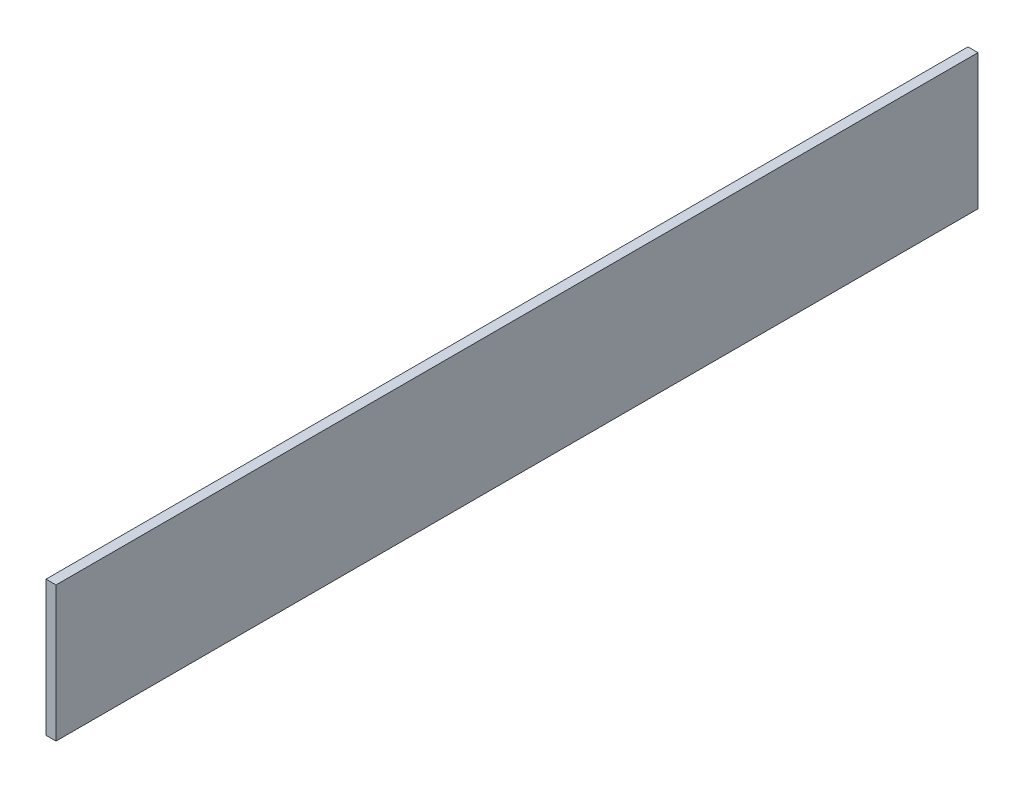
ISO-10303-21;
HEADER;
FILE_DESCRIPTION(('STEP AP214'),'2;1');
FILE_NAME('part.step','',(''),(''),'','','');
FILE_SCHEMA(('AUTOMOTIVE_DESIGN { 1 0 10303 214 1 1 1 1 }'));
ENDSEC;
DATA;
#1=APPLICATION_CONTEXT('core data for automotive mechanical design processes');
#2=APPLICATION_PROTOCOL_DEFINITION('international standard','automotive_design',2000,#1);
#3=PRODUCT_CONTEXT('',#1,'mechanical');
#4=PRODUCT('Part','Part','',(#3));
#5=PRODUCT_RELATED_PRODUCT_CATEGORY('part','',(#4));
#6=PRODUCT_DEFINITION_FORMATION('','',#4);
#7=PRODUCT_DEFINITION_CONTEXT('part definition',#1,'design');
#8=PRODUCT_DEFINITION('design','',#6,#7);
#9=PRODUCT_DEFINITION_SHAPE('','',#8);
#10=(LENGTH_UNIT() NAMED_UNIT(*) SI_UNIT(.MILLI.,.METRE.));
#11=(NAMED_UNIT(*) PLANE_ANGLE_UNIT() SI_UNIT($,.RADIAN.));
#12=(NAMED_UNIT(*) SI_UNIT($,.STERADIAN.) SOLID_ANGLE_UNIT());
#13=UNCERTAINTY_MEASURE_WITH_UNIT(LENGTH_MEASURE(1.E-05),#10,'distance_accuracy_value','');
#14=(GEOMETRIC_REPRESENTATION_CONTEXT(3) GLOBAL_UNCERTAINTY_ASSIGNED_CONTEXT((#13)) GLOBAL_UNIT_ASSIGNED_CONTEXT((#10,
#11,#12)) REPRESENTATION_CONTEXT('',''));
#15=CARTESIAN_POINT('',(0.,0.,0.));
#16=DIRECTION('',(0.,0.,1.));
#17=DIRECTION('',(1.,0.,0.));
#18=AXIS2_PLACEMENT_3D('',#15,#16,#17);
#19=CARTESIAN_POINT('',(-5.,-67.5000000000002,920.));
#20=DIRECTION('',(1.,0.,0.));
#21=DIRECTION('',(0.,0.,-1.));
#22=AXIS2_PLACEMENT_3D('',#19,#20,#21);
#23=PLANE('',#22);
#24=DIRECTION('',(0.,-1.,0.));
#25=VECTOR('',#24,1.);
#26=CARTESIAN_POINT('',(-5.,-67.5000000000002,0.));
#27=LINE('',#26,#25);
#28=CARTESIAN_POINT('',(-5.,67.4999999999998,0.));
#29=VERTEX_POINT('',#28);
#30=CARTESIAN_POINT('',(-5.,-67.5000000000002,0.));
#31=VERTEX_POINT('',#30);
#32=EDGE_CURVE('E105',#29,#31,#27,.T.);
#33=ORIENTED_EDGE('',*,*,#32,.T.);
#34=DIRECTION('',(0.,0.,-1.));
#35=VECTOR('',#34,1.);
#36=CARTESIAN_POINT('',(-5.,-67.5000000000002,920.));
#37=LINE('',#36,#35);
#38=CARTESIAN_POINT('',(-5.,-67.5000000000002,920.));
#39=VERTEX_POINT('',#38);
#40=EDGE_CURVE('E11',#39,#31,#37,.T.);
#41=ORIENTED_EDGE('',*,*,#40,.F.);
#42=DIRECTION('',(0.,-1.,0.));
#43=VECTOR('',#42,1.);
#44=CARTESIAN_POINT('',(-5.,-67.5000000000002,920.));
#45=LINE('',#44,#43);
#46=CARTESIAN_POINT('',(-5.,67.4999999999998,920.));
#47=VERTEX_POINT('',#46);
#48=EDGE_CURVE('E89',#47,#39,#45,.T.);
#49=ORIENTED_EDGE('',*,*,#48,.F.);
#50=DIRECTION('',(0.,0.,-1.));
#51=VECTOR('',#50,1.);
#52=CARTESIAN_POINT('',(-5.,67.4999999999998,920.));
#53=LINE('',#52,#51);
#54=EDGE_CURVE('E97',#47,#29,#53,.T.);
#55=ORIENTED_EDGE('',*,*,#54,.T.);
#56=EDGE_LOOP('',(#33,#41,#49,#55));
#57=FACE_BOUND('',#56,.T.);
#58=ADVANCED_FACE('F39',(#57),#23,.F.);
#59=CARTESIAN_POINT('',(5.00000000000001,-67.5000000000002,920.));
#60=DIRECTION('',(0.,1.,0.));
#61=DIRECTION('',(-1.,0.,0.));
#62=AXIS2_PLACEMENT_3D('',#59,#60,#61);
#63=PLANE('',#62);
#64=DIRECTION('',(1.,0.,0.));
#65=VECTOR('',#64,1.);
#66=CARTESIAN_POINT('',(5.00000000000001,-67.5000000000002,0.));
#67=LINE('',#66,#65);
#68=CARTESIAN_POINT('',(5.00000000000001,-67.5000000000002,0.));
#69=VERTEX_POINT('',#68);
#70=EDGE_CURVE('E92',#31,#69,#67,.T.);
#71=ORIENTED_EDGE('',*,*,#70,.T.);
#72=DIRECTION('',(0.,0.,-1.));
#73=VECTOR('',#72,1.);
#74=CARTESIAN_POINT('',(5.00000000000001,-67.5000000000002,920.));
#75=LINE('',#74,#73);
#76=CARTESIAN_POINT('',(5.00000000000001,-67.5000000000002,920.));
#77=VERTEX_POINT('',#76);
#78=EDGE_CURVE('E50',#77,#69,#75,.T.);
#79=ORIENTED_EDGE('',*,*,#78,.F.);
#80=DIRECTION('',(1.,0.,0.));
#81=VECTOR('',#80,1.);
#82=CARTESIAN_POINT('',(5.00000000000001,-67.5000000000002,920.));
#83=LINE('',#82,#81);
#84=EDGE_CURVE('E82',#39,#77,#83,.T.);
#85=ORIENTED_EDGE('',*,*,#84,.F.);
#86=ORIENTED_EDGE('',*,*,#40,.T.);
#87=EDGE_LOOP('',(#71,#79,#85,#86));
#88=FACE_BOUND('',#87,.T.);
#89=ADVANCED_FACE('F93',(#88),#63,.F.);
#90=CARTESIAN_POINT('',(5.00000000000001,-67.5000000000002,920.));
#91=DIRECTION('',(-1.,0.,0.));
#92=DIRECTION('',(0.,0.,1.));
#93=AXIS2_PLACEMENT_3D('',#90,#91,#92);
#94=PLANE('',#93);
#95=DIRECTION('',(0.,1.,0.));
#96=VECTOR('',#95,1.);
#97=CARTESIAN_POINT('',(5.00000000000001,-67.5000000000002,0.));
#98=LINE('',#97,#96);
#99=CARTESIAN_POINT('',(5.00000000000001,67.4999999999998,0.));
#100=VERTEX_POINT('',#99);
#101=EDGE_CURVE('E72',#69,#100,#98,.T.);
#102=ORIENTED_EDGE('',*,*,#101,.T.);
#103=DIRECTION('',(0.,0.,-1.));
#104=VECTOR('',#103,1.);
#105=CARTESIAN_POINT('',(5.00000000000001,67.4999999999998,920.));
#106=LINE('',#105,#104);
#107=CARTESIAN_POINT('',(5.00000000000001,67.4999999999998,920.));
#108=VERTEX_POINT('',#107);
#109=EDGE_CURVE('E94',#108,#100,#106,.T.);
#110=ORIENTED_EDGE('',*,*,#109,.F.);
#111=DIRECTION('',(0.,1.,0.));
#112=VECTOR('',#111,1.);
#113=CARTESIAN_POINT('',(5.00000000000001,-67.5000000000002,920.));
#114=LINE('',#113,#112);
#115=EDGE_CURVE('E88',#77,#108,#114,.T.);
#116=ORIENTED_EDGE('',*,*,#115,.F.);
#117=ORIENTED_EDGE('',*,*,#78,.T.);
#118=EDGE_LOOP('',(#102,#110,#116,#117));
#119=FACE_BOUND('',#118,.T.);
#120=ADVANCED_FACE('F96',(#119),#94,.F.);
#121=CARTESIAN_POINT('',(5.00000000000001,67.4999999999998,920.));
#122=DIRECTION('',(0.,-1.,0.));
#123=DIRECTION('',(0.,0.,-1.));
#124=AXIS2_PLACEMENT_3D('',#121,#122,#123);
#125=PLANE('',#124);
#126=DIRECTION('',(-1.,0.,0.));
#127=VECTOR('',#126,1.);
#128=CARTESIAN_POINT('',(5.00000000000001,67.4999999999998,0.));
#129=LINE('',#128,#127);
#130=EDGE_CURVE('E76',#100,#29,#129,.T.);
#131=ORIENTED_EDGE('',*,*,#130,.T.);
#132=ORIENTED_EDGE('',*,*,#54,.F.);
#133=DIRECTION('',(-1.,0.,0.));
#134=VECTOR('',#133,1.);
#135=CARTESIAN_POINT('',(5.00000000000001,67.4999999999998,920.));
#136=LINE('',#135,#134);
#137=EDGE_CURVE('E54',#108,#47,#136,.T.);
#138=ORIENTED_EDGE('',*,*,#137,.F.);
#139=ORIENTED_EDGE('',*,*,#109,.T.);
#140=EDGE_LOOP('',(#131,#132,#138,#139));
#141=FACE_BOUND('',#140,.T.);
#142=ADVANCED_FACE('F108',(#141),#125,.F.);
#143=CARTESIAN_POINT('',(0.,0.,920.));
#144=DIRECTION('',(0.,0.,1.));
#145=DIRECTION('',(1.,0.,0.));
#146=AXIS2_PLACEMENT_3D('',#143,#144,#145);
#147=PLANE('',#146);
#148=ORIENTED_EDGE('',*,*,#48,.T.);
#149=ORIENTED_EDGE('',*,*,#84,.T.);
#150=ORIENTED_EDGE('',*,*,#115,.T.);
#151=ORIENTED_EDGE('',*,*,#137,.T.);
#152=EDGE_LOOP('',(#148,#149,#150,#151));
#153=FACE_BOUND('',#152,.T.);
#154=ADVANCED_FACE('F86',(#153),#147,.T.);
#155=CARTESIAN_POINT('',(0.,0.,0.));
#156=DIRECTION('',(0.,0.,1.));
#157=DIRECTION('',(1.,0.,0.));
#158=AXIS2_PLACEMENT_3D('',#155,#156,#157);
#159=PLANE('',#158);
#160=ORIENTED_EDGE('',*,*,#32,.F.);
#161=ORIENTED_EDGE('',*,*,#130,.F.);
#162=ORIENTED_EDGE('',*,*,#101,.F.);
#163=ORIENTED_EDGE('',*,*,#70,.F.);
#164=EDGE_LOOP('',(#160,#161,#162,#163));
#165=FACE_BOUND('',#164,.T.);
#166=ADVANCED_FACE('F115',(#165),#159,.F.);
#167=CLOSED_SHELL('',(#58,#89,#120,#142,#154,#166));
#168=MANIFOLD_SOLID_BREP('B2',#167);
#169=ADVANCED_BREP_SHAPE_REPRESENTATION('',(#18,#168),#14);
#170=SHAPE_DEFINITION_REPRESENTATION(#9,#169);
ENDSEC;
END-ISO-10303-21;
